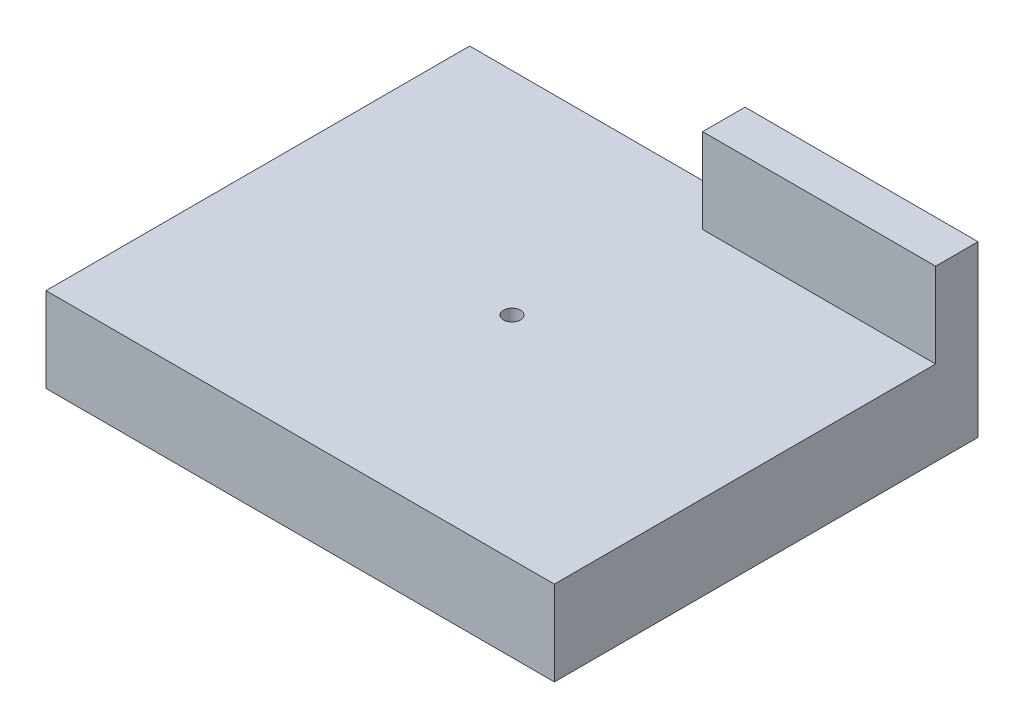
ISO-10303-21;
HEADER;
FILE_DESCRIPTION(('STEP AP214'),'2;1');
FILE_NAME('part.step','',(''),(''),'','','');
FILE_SCHEMA(('AUTOMOTIVE_DESIGN { 1 0 10303 214 1 1 1 1 }'));
ENDSEC;
DATA;
#1=APPLICATION_CONTEXT('core data for automotive mechanical design processes');
#2=APPLICATION_PROTOCOL_DEFINITION('international standard','automotive_design',2000,#1);
#3=PRODUCT_CONTEXT('',#1,'mechanical');
#4=PRODUCT('Part','Part','',(#3));
#5=PRODUCT_RELATED_PRODUCT_CATEGORY('part','',(#4));
#6=PRODUCT_DEFINITION_FORMATION('','',#4);
#7=PRODUCT_DEFINITION_CONTEXT('part definition',#1,'design');
#8=PRODUCT_DEFINITION('design','',#6,#7);
#9=PRODUCT_DEFINITION_SHAPE('','',#8);
#10=(LENGTH_UNIT() NAMED_UNIT(*) SI_UNIT(.MILLI.,.METRE.));
#11=(NAMED_UNIT(*) PLANE_ANGLE_UNIT() SI_UNIT($,.RADIAN.));
#12=(NAMED_UNIT(*) SI_UNIT($,.STERADIAN.) SOLID_ANGLE_UNIT());
#13=UNCERTAINTY_MEASURE_WITH_UNIT(LENGTH_MEASURE(1.E-05),#10,'distance_accuracy_value','');
#14=(GEOMETRIC_REPRESENTATION_CONTEXT(3) GLOBAL_UNCERTAINTY_ASSIGNED_CONTEXT((#13)) GLOBAL_UNIT_ASSIGNED_CONTEXT((#10,
#11,#12)) REPRESENTATION_CONTEXT('',''));
#15=CARTESIAN_POINT('',(0.,0.,0.));
#16=DIRECTION('',(0.,0.,1.));
#17=DIRECTION('',(1.,0.,0.));
#18=AXIS2_PLACEMENT_3D('',#15,#16,#17);
#19=CARTESIAN_POINT('',(-30.,20.,25.));
#20=DIRECTION('',(1.,0.,0.));
#21=DIRECTION('',(0.,0.,-1.));
#22=AXIS2_PLACEMENT_3D('',#19,#20,#21);
#23=PLANE('',#22);
#24=DIRECTION('',(0.,0.,1.));
#25=VECTOR('',#24,1.);
#26=CARTESIAN_POINT('',(-30.,10.,-25.));
#27=LINE('',#26,#25);
#28=CARTESIAN_POINT('',(-30.,10.,-25.));
#29=VERTEX_POINT('',#28);
#30=CARTESIAN_POINT('',(-30.,10.,25.));
#31=VERTEX_POINT('',#30);
#32=EDGE_CURVE('E161',#29,#31,#27,.T.);
#33=ORIENTED_EDGE('',*,*,#32,.F.);
#34=DIRECTION('',(0.,-1.,0.));
#35=VECTOR('',#34,1.);
#36=CARTESIAN_POINT('',(-30.,20.,-25.));
#37=LINE('',#36,#35);
#38=CARTESIAN_POINT('',(-30.,0.,-25.));
#39=VERTEX_POINT('',#38);
#40=EDGE_CURVE('E41',#29,#39,#37,.T.);
#41=ORIENTED_EDGE('',*,*,#40,.T.);
#42=DIRECTION('',(0.,0.,1.));
#43=VECTOR('',#42,1.);
#44=CARTESIAN_POINT('',(-30.,0.,25.));
#45=LINE('',#44,#43);
#46=CARTESIAN_POINT('',(-30.,0.,25.));
#47=VERTEX_POINT('',#46);
#48=EDGE_CURVE('E91',#39,#47,#45,.T.);
#49=ORIENTED_EDGE('',*,*,#48,.T.);
#50=DIRECTION('',(0.,-1.,0.));
#51=VECTOR('',#50,1.);
#52=CARTESIAN_POINT('',(-30.,20.,25.));
#53=LINE('',#52,#51);
#54=EDGE_CURVE('E76',#31,#47,#53,.T.);
#55=ORIENTED_EDGE('',*,*,#54,.F.);
#56=EDGE_LOOP('',(#33,#41,#49,#55));
#57=FACE_BOUND('',#56,.T.);
#58=ADVANCED_FACE('F33',(#57),#23,.F.);
#59=CARTESIAN_POINT('',(-30.,20.,25.));
#60=DIRECTION('',(0.,0.,-1.));
#61=DIRECTION('',(-1.,0.,0.));
#62=AXIS2_PLACEMENT_3D('',#59,#60,#61);
#63=PLANE('',#62);
#64=DIRECTION('',(1.,0.,0.));
#65=VECTOR('',#64,1.);
#66=CARTESIAN_POINT('',(-30.,10.,25.));
#67=LINE('',#66,#65);
#68=CARTESIAN_POINT('',(30.,10.,25.));
#69=VERTEX_POINT('',#68);
#70=EDGE_CURVE('E85',#31,#69,#67,.T.);
#71=ORIENTED_EDGE('',*,*,#70,.F.);
#72=ORIENTED_EDGE('',*,*,#54,.T.);
#73=DIRECTION('',(1.,0.,0.));
#74=VECTOR('',#73,1.);
#75=CARTESIAN_POINT('',(-30.,0.,25.));
#76=LINE('',#75,#74);
#77=CARTESIAN_POINT('',(30.,0.,25.));
#78=VERTEX_POINT('',#77);
#79=EDGE_CURVE('E81',#47,#78,#76,.T.);
#80=ORIENTED_EDGE('',*,*,#79,.T.);
#81=DIRECTION('',(0.,-1.,0.));
#82=VECTOR('',#81,1.);
#83=CARTESIAN_POINT('',(30.,20.,25.));
#84=LINE('',#83,#82);
#85=EDGE_CURVE('E88',#69,#78,#84,.T.);
#86=ORIENTED_EDGE('',*,*,#85,.F.);
#87=EDGE_LOOP('',(#71,#72,#80,#86));
#88=FACE_BOUND('',#87,.T.);
#89=ADVANCED_FACE('F78',(#88),#63,.F.);
#90=CARTESIAN_POINT('',(30.,20.,25.));
#91=DIRECTION('',(-1.,0.,0.));
#92=DIRECTION('',(0.,0.,1.));
#93=AXIS2_PLACEMENT_3D('',#90,#91,#92);
#94=PLANE('',#93);
#95=DIRECTION('',(0.,0.,-1.));
#96=VECTOR('',#95,1.);
#97=CARTESIAN_POINT('',(30.,20.,25.));
#98=LINE('',#97,#96);
#99=CARTESIAN_POINT('',(30.,20.,-20.));
#100=VERTEX_POINT('',#99);
#101=CARTESIAN_POINT('',(30.,20.,-25.));
#102=VERTEX_POINT('',#101);
#103=EDGE_CURVE('E56',#100,#102,#98,.T.);
#104=ORIENTED_EDGE('',*,*,#103,.F.);
#105=DIRECTION('',(0.,1.,0.));
#106=VECTOR('',#105,1.);
#107=CARTESIAN_POINT('',(30.,10.,-20.));
#108=LINE('',#107,#106);
#109=CARTESIAN_POINT('',(30.,10.,-20.));
#110=VERTEX_POINT('',#109);
#111=EDGE_CURVE('E48',#110,#100,#108,.T.);
#112=ORIENTED_EDGE('',*,*,#111,.F.);
#113=DIRECTION('',(0.,0.,-1.));
#114=VECTOR('',#113,1.);
#115=CARTESIAN_POINT('',(30.,10.,-20.));
#116=LINE('',#115,#114);
#117=EDGE_CURVE('E166',#69,#110,#116,.T.);
#118=ORIENTED_EDGE('',*,*,#117,.F.);
#119=ORIENTED_EDGE('',*,*,#85,.T.);
#120=DIRECTION('',(0.,0.,-1.));
#121=VECTOR('',#120,1.);
#122=CARTESIAN_POINT('',(30.,0.,25.));
#123=LINE('',#122,#121);
#124=CARTESIAN_POINT('',(30.,0.,-25.));
#125=VERTEX_POINT('',#124);
#126=EDGE_CURVE('E99',#78,#125,#123,.T.);
#127=ORIENTED_EDGE('',*,*,#126,.T.);
#128=DIRECTION('',(0.,-1.,0.));
#129=VECTOR('',#128,1.);
#130=CARTESIAN_POINT('',(30.,20.,-25.));
#131=LINE('',#130,#129);
#132=EDGE_CURVE('E11',#102,#125,#131,.T.);
#133=ORIENTED_EDGE('',*,*,#132,.F.);
#134=EDGE_LOOP('',(#104,#112,#118,#119,#127,#133));
#135=FACE_BOUND('',#134,.T.);
#136=ADVANCED_FACE('F35',(#135),#94,.F.);
#137=CARTESIAN_POINT('',(-30.,20.,-25.));
#138=DIRECTION('',(0.,0.,1.));
#139=DIRECTION('',(1.,0.,0.));
#140=AXIS2_PLACEMENT_3D('',#137,#138,#139);
#141=PLANE('',#140);
#142=DIRECTION('',(-1.,0.,0.));
#143=VECTOR('',#142,1.);
#144=CARTESIAN_POINT('',(-30.,10.,-25.));
#145=LINE('',#144,#143);
#146=CARTESIAN_POINT('',(2.5,10.,-25.));
#147=VERTEX_POINT('',#146);
#148=EDGE_CURVE('E175',#147,#29,#145,.T.);
#149=ORIENTED_EDGE('',*,*,#148,.F.);
#150=DIRECTION('',(0.,1.,0.));
#151=VECTOR('',#150,1.);
#152=CARTESIAN_POINT('',(2.5,10.,-25.));
#153=LINE('',#152,#151);
#154=CARTESIAN_POINT('',(2.5,20.,-25.));
#155=VERTEX_POINT('',#154);
#156=EDGE_CURVE('E111',#147,#155,#153,.T.);
#157=ORIENTED_EDGE('',*,*,#156,.T.);
#158=DIRECTION('',(-1.,0.,0.));
#159=VECTOR('',#158,1.);
#160=CARTESIAN_POINT('',(-30.,20.,-25.));
#161=LINE('',#160,#159);
#162=EDGE_CURVE('E101',#102,#155,#161,.T.);
#163=ORIENTED_EDGE('',*,*,#162,.F.);
#164=ORIENTED_EDGE('',*,*,#132,.T.);
#165=DIRECTION('',(-1.,0.,0.));
#166=VECTOR('',#165,1.);
#167=CARTESIAN_POINT('',(-30.,0.,-25.));
#168=LINE('',#167,#166);
#169=EDGE_CURVE('E95',#125,#39,#168,.T.);
#170=ORIENTED_EDGE('',*,*,#169,.T.);
#171=ORIENTED_EDGE('',*,*,#40,.F.);
#172=EDGE_LOOP('',(#149,#157,#163,#164,#170,#171));
#173=FACE_BOUND('',#172,.T.);
#174=ADVANCED_FACE('F114',(#173),#141,.F.);
#175=CARTESIAN_POINT('',(0.,20.,0.));
#176=DIRECTION('',(0.,-1.,0.));
#177=DIRECTION('',(0.,0.,-1.));
#178=AXIS2_PLACEMENT_3D('',#175,#176,#177);
#179=PLANE('',#178);
#180=ORIENTED_EDGE('',*,*,#162,.T.);
#181=DIRECTION('',(0.,0.,-1.));
#182=VECTOR('',#181,1.);
#183=CARTESIAN_POINT('',(2.5,20.,-25.));
#184=LINE('',#183,#182);
#185=CARTESIAN_POINT('',(2.5,20.,-20.));
#186=VERTEX_POINT('',#185);
#187=EDGE_CURVE('E164',#186,#155,#184,.T.);
#188=ORIENTED_EDGE('',*,*,#187,.F.);
#189=DIRECTION('',(-1.,0.,0.));
#190=VECTOR('',#189,1.);
#191=CARTESIAN_POINT('',(2.5,20.,-20.));
#192=LINE('',#191,#190);
#193=EDGE_CURVE('E158',#100,#186,#192,.T.);
#194=ORIENTED_EDGE('',*,*,#193,.F.);
#195=ORIENTED_EDGE('',*,*,#103,.T.);
#196=EDGE_LOOP('',(#180,#188,#194,#195));
#197=FACE_BOUND('',#196,.T.);
#198=ADVANCED_FACE('F122',(#197),#179,.F.);
#199=CARTESIAN_POINT('',(0.,0.,0.));
#200=DIRECTION('',(0.,-1.,0.));
#201=DIRECTION('',(0.,0.,-1.));
#202=AXIS2_PLACEMENT_3D('',#199,#200,#201);
#203=PLANE('',#202);
#204=CARTESIAN_POINT('',(0.,0.,0.));
#205=DIRECTION('',(0.,1.,0.));
#206=DIRECTION('',(0.,0.,1.));
#207=AXIS2_PLACEMENT_3D('',#204,#205,#206);
#208=CIRCLE('',#207,0.999999999999998);
#209=CARTESIAN_POINT('',(0.,0.,0.999999999999998));
#210=VERTEX_POINT('',#209);
#211=EDGE_CURVE('E153',#210,#210,#208,.T.);
#212=ORIENTED_EDGE('',*,*,#211,.T.);
#213=EDGE_LOOP('',(#212));
#214=FACE_BOUND('',#213,.T.);
#215=ORIENTED_EDGE('',*,*,#126,.F.);
#216=ORIENTED_EDGE('',*,*,#79,.F.);
#217=ORIENTED_EDGE('',*,*,#48,.F.);
#218=ORIENTED_EDGE('',*,*,#169,.F.);
#219=EDGE_LOOP('',(#215,#216,#217,#218));
#220=FACE_BOUND('',#219,.T.);
#221=ADVANCED_FACE('F97',(#214,#220),#203,.T.);
#222=CARTESIAN_POINT('',(2.5,10.,-25.));
#223=DIRECTION('',(1.,0.,0.));
#224=DIRECTION('',(0.,0.,-1.));
#225=AXIS2_PLACEMENT_3D('',#222,#223,#224);
#226=PLANE('',#225);
#227=ORIENTED_EDGE('',*,*,#187,.T.);
#228=ORIENTED_EDGE('',*,*,#156,.F.);
#229=DIRECTION('',(0.,0.,-1.));
#230=VECTOR('',#229,1.);
#231=CARTESIAN_POINT('',(2.5,10.,-25.));
#232=LINE('',#231,#230);
#233=CARTESIAN_POINT('',(2.5,10.,-20.));
#234=VERTEX_POINT('',#233);
#235=EDGE_CURVE('E172',#234,#147,#232,.T.);
#236=ORIENTED_EDGE('',*,*,#235,.F.);
#237=DIRECTION('',(0.,1.,0.));
#238=VECTOR('',#237,1.);
#239=CARTESIAN_POINT('',(2.5,10.,-20.));
#240=LINE('',#239,#238);
#241=EDGE_CURVE('E182',#234,#186,#240,.T.);
#242=ORIENTED_EDGE('',*,*,#241,.T.);
#243=EDGE_LOOP('',(#227,#228,#236,#242));
#244=FACE_BOUND('',#243,.T.);
#245=ADVANCED_FACE('F131',(#244),#226,.F.);
#246=CARTESIAN_POINT('',(2.5,10.,-20.));
#247=DIRECTION('',(0.,0.,-1.));
#248=DIRECTION('',(-1.,0.,0.));
#249=AXIS2_PLACEMENT_3D('',#246,#247,#248);
#250=PLANE('',#249);
#251=ORIENTED_EDGE('',*,*,#193,.T.);
#252=ORIENTED_EDGE('',*,*,#241,.F.);
#253=DIRECTION('',(-1.,0.,0.));
#254=VECTOR('',#253,1.);
#255=CARTESIAN_POINT('',(2.5,10.,-20.));
#256=LINE('',#255,#254);
#257=EDGE_CURVE('E169',#110,#234,#256,.T.);
#258=ORIENTED_EDGE('',*,*,#257,.F.);
#259=ORIENTED_EDGE('',*,*,#111,.T.);
#260=EDGE_LOOP('',(#251,#252,#258,#259));
#261=FACE_BOUND('',#260,.T.);
#262=ADVANCED_FACE('F135',(#261),#250,.F.);
#263=CARTESIAN_POINT('',(0.,10.,0.));
#264=DIRECTION('',(0.,1.,0.));
#265=DIRECTION('',(0.,0.,1.));
#266=AXIS2_PLACEMENT_3D('',#263,#264,#265);
#267=PLANE('',#266);
#268=CARTESIAN_POINT('',(0.,10.,0.));
#269=DIRECTION('',(0.,1.,0.));
#270=DIRECTION('',(0.,0.,1.));
#271=AXIS2_PLACEMENT_3D('',#268,#269,#270);
#272=CIRCLE('',#271,0.999999999999999);
#273=CARTESIAN_POINT('',(0.,10.,0.999999999999999));
#274=VERTEX_POINT('',#273);
#275=EDGE_CURVE('E156',#274,#274,#272,.T.);
#276=ORIENTED_EDGE('',*,*,#275,.F.);
#277=EDGE_LOOP('',(#276));
#278=FACE_BOUND('',#277,.T.);
#279=ORIENTED_EDGE('',*,*,#32,.T.);
#280=ORIENTED_EDGE('',*,*,#70,.T.);
#281=ORIENTED_EDGE('',*,*,#117,.T.);
#282=ORIENTED_EDGE('',*,*,#257,.T.);
#283=ORIENTED_EDGE('',*,*,#235,.T.);
#284=ORIENTED_EDGE('',*,*,#148,.T.);
#285=EDGE_LOOP('',(#279,#280,#281,#282,#283,#284));
#286=FACE_BOUND('',#285,.T.);
#287=ADVANCED_FACE('F138',(#278,#286),#267,.T.);
#288=CARTESIAN_POINT('',(0.,10.,0.));
#289=DIRECTION('',(0.,1.,0.));
#290=DIRECTION('',(0.,0.,1.));
#291=AXIS2_PLACEMENT_3D('',#288,#289,#290);
#292=CYLINDRICAL_SURFACE('',#291,0.999999999999998);
#293=ORIENTED_EDGE('',*,*,#211,.F.);
#294=EDGE_LOOP('',(#293));
#295=FACE_BOUND('',#294,.T.);
#296=ORIENTED_EDGE('',*,*,#275,.T.);
#297=EDGE_LOOP('',(#296));
#298=FACE_BOUND('',#297,.T.);
#299=ADVANCED_FACE('F144',(#295,#298),#292,.F.);
#300=CLOSED_SHELL('',(#58,#89,#136,#174,#198,#221,#245,#262,#287,#299));
#301=MANIFOLD_SOLID_BREP('B2',#300);
#302=ADVANCED_BREP_SHAPE_REPRESENTATION('',(#18,#301),#14);
#303=SHAPE_DEFINITION_REPRESENTATION(#9,#302);
ENDSEC;
END-ISO-10303-21;
